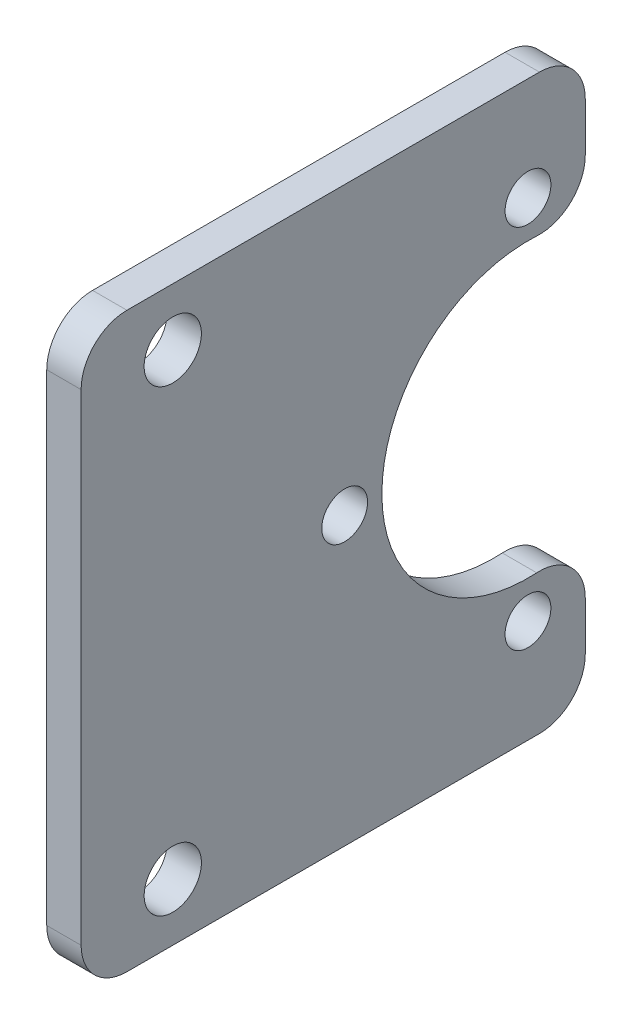
ISO-10303-21;
HEADER;
FILE_DESCRIPTION(('STEP AP214'),'2;1');
FILE_NAME('part.step','',(''),(''),'','','');
FILE_SCHEMA(('AUTOMOTIVE_DESIGN { 1 0 10303 214 1 1 1 1 }'));
ENDSEC;
DATA;
#1=APPLICATION_CONTEXT('core data for automotive mechanical design processes');
#2=APPLICATION_PROTOCOL_DEFINITION('international standard','automotive_design',2000,#1);
#3=PRODUCT_CONTEXT('',#1,'mechanical');
#4=PRODUCT('Part','Part','',(#3));
#5=PRODUCT_RELATED_PRODUCT_CATEGORY('part','',(#4));
#6=PRODUCT_DEFINITION_FORMATION('','',#4);
#7=PRODUCT_DEFINITION_CONTEXT('part definition',#1,'design');
#8=PRODUCT_DEFINITION('design','',#6,#7);
#9=PRODUCT_DEFINITION_SHAPE('','',#8);
#10=(LENGTH_UNIT() NAMED_UNIT(*) SI_UNIT(.MILLI.,.METRE.));
#11=(NAMED_UNIT(*) PLANE_ANGLE_UNIT() SI_UNIT($,.RADIAN.));
#12=(NAMED_UNIT(*) SI_UNIT($,.STERADIAN.) SOLID_ANGLE_UNIT());
#13=UNCERTAINTY_MEASURE_WITH_UNIT(LENGTH_MEASURE(1.E-05),#10,'distance_accuracy_value','');
#14=(GEOMETRIC_REPRESENTATION_CONTEXT(3) GLOBAL_UNCERTAINTY_ASSIGNED_CONTEXT((#13)) GLOBAL_UNIT_ASSIGNED_CONTEXT((#10,
#11,#12)) REPRESENTATION_CONTEXT('',''));
#15=CARTESIAN_POINT('',(0.,0.,0.));
#16=DIRECTION('',(0.,0.,1.));
#17=DIRECTION('',(1.,0.,0.));
#18=AXIS2_PLACEMENT_3D('',#15,#16,#17);
#19=CARTESIAN_POINT('',(3.,0.,-39.));
#20=DIRECTION('',(1.,0.,0.));
#21=DIRECTION('',(0.,0.,-1.));
#22=AXIS2_PLACEMENT_3D('',#19,#20,#21);
#23=PLANE('',#22);
#24=CARTESIAN_POINT('',(3.,20.,-8.));
#25=DIRECTION('',(1.,0.,0.));
#26=DIRECTION('',(0.,0.,-1.));
#27=AXIS2_PLACEMENT_3D('',#24,#25,#26);
#28=CIRCLE('',#27,2.5);
#29=CARTESIAN_POINT('',(3.,20.,-10.5));
#30=VERTEX_POINT('',#29);
#31=EDGE_CURVE('E252',#30,#30,#28,.T.);
#32=ORIENTED_EDGE('',*,*,#31,.F.);
#33=EDGE_LOOP('',(#32));
#34=FACE_BOUND('',#33,.T.);
#35=CARTESIAN_POINT('',(3.,16.,-39.));
#36=DIRECTION('',(1.,0.,0.));
#37=DIRECTION('',(0.,0.,-1.));
#38=AXIS2_PLACEMENT_3D('',#35,#36,#37);
#39=CIRCLE('',#38,2.);
#40=CARTESIAN_POINT('',(3.,16.,-41.));
#41=VERTEX_POINT('',#40);
#42=EDGE_CURVE('E241',#41,#41,#39,.T.);
#43=ORIENTED_EDGE('',*,*,#42,.F.);
#44=EDGE_LOOP('',(#43));
#45=FACE_BOUND('',#44,.T.);
#46=DIRECTION('',(0.,1.,0.));
#47=VECTOR('',#46,1.);
#48=CARTESIAN_POINT('',(3.,25.,-44.));
#49=LINE('',#48,#47);
#50=CARTESIAN_POINT('',(3.,16.720122607206,-44.));
#51=VERTEX_POINT('',#50);
#52=CARTESIAN_POINT('',(3.,21.,-44.));
#53=VERTEX_POINT('',#52);
#54=EDGE_CURVE('E230',#51,#53,#49,.T.);
#55=ORIENTED_EDGE('',*,*,#54,.T.);
#56=CARTESIAN_POINT('',(3.,21.,-40.));
#57=DIRECTION('',(1.,0.,0.));
#58=DIRECTION('',(0.,0.,-1.));
#59=AXIS2_PLACEMENT_3D('',#56,#57,#58);
#60=CIRCLE('',#59,4.);
#61=CARTESIAN_POINT('',(3.,25.,-40.));
#62=VERTEX_POINT('',#61);
#63=EDGE_CURVE('E181',#53,#62,#60,.T.);
#64=ORIENTED_EDGE('',*,*,#63,.T.);
#65=DIRECTION('',(0.,0.,1.));
#66=VECTOR('',#65,1.);
#67=CARTESIAN_POINT('',(3.,25.,0.));
#68=LINE('',#67,#66);
#69=CARTESIAN_POINT('',(3.,25.,-4.00000000000001));
#70=VERTEX_POINT('',#69);
#71=EDGE_CURVE('E143',#62,#70,#68,.T.);
#72=ORIENTED_EDGE('',*,*,#71,.T.);
#73=CARTESIAN_POINT('',(3.,21.,-4.00000000000001));
#74=DIRECTION('',(1.,0.,0.));
#75=DIRECTION('',(0.,0.,-1.));
#76=AXIS2_PLACEMENT_3D('',#73,#74,#75);
#77=CIRCLE('',#76,4.);
#78=CARTESIAN_POINT('',(3.,21.,0.));
#79=VERTEX_POINT('',#78);
#80=EDGE_CURVE('E172',#70,#79,#77,.T.);
#81=ORIENTED_EDGE('',*,*,#80,.T.);
#82=DIRECTION('',(0.,-1.,0.));
#83=VECTOR('',#82,1.);
#84=CARTESIAN_POINT('',(3.,25.,0.));
#85=LINE('',#84,#83);
#86=CARTESIAN_POINT('',(3.,-21.,0.));
#87=VERTEX_POINT('',#86);
#88=EDGE_CURVE('E150',#79,#87,#85,.T.);
#89=ORIENTED_EDGE('',*,*,#88,.T.);
#90=CARTESIAN_POINT('',(3.,-21.,-4.00000000000001));
#91=DIRECTION('',(1.,0.,0.));
#92=DIRECTION('',(0.,0.,-1.));
#93=AXIS2_PLACEMENT_3D('',#90,#91,#92);
#94=CIRCLE('',#93,4.);
#95=CARTESIAN_POINT('',(3.,-25.,-4.00000000000001));
#96=VERTEX_POINT('',#95);
#97=EDGE_CURVE('E174',#87,#96,#94,.T.);
#98=ORIENTED_EDGE('',*,*,#97,.T.);
#99=DIRECTION('',(0.,0.,-1.));
#100=VECTOR('',#99,1.);
#101=CARTESIAN_POINT('',(3.,-25.,0.));
#102=LINE('',#101,#100);
#103=CARTESIAN_POINT('',(3.,-25.,-40.));
#104=VERTEX_POINT('',#103);
#105=EDGE_CURVE('E154',#96,#104,#102,.T.);
#106=ORIENTED_EDGE('',*,*,#105,.T.);
#107=CARTESIAN_POINT('',(3.,-21.,-40.));
#108=DIRECTION('',(1.,0.,0.));
#109=DIRECTION('',(0.,0.,-1.));
#110=AXIS2_PLACEMENT_3D('',#107,#108,#109);
#111=CIRCLE('',#110,4.);
#112=CARTESIAN_POINT('',(3.,-21.,-44.));
#113=VERTEX_POINT('',#112);
#114=EDGE_CURVE('E176',#104,#113,#111,.T.);
#115=ORIENTED_EDGE('',*,*,#114,.T.);
#116=DIRECTION('',(0.,1.,0.));
#117=VECTOR('',#116,1.);
#118=CARTESIAN_POINT('',(3.,-11.7287041057399,-44.));
#119=LINE('',#118,#117);
#120=CARTESIAN_POINT('',(3.,-16.720122607206,-44.));
#121=VERTEX_POINT('',#120);
#122=EDGE_CURVE('E234',#113,#121,#119,.T.);
#123=ORIENTED_EDGE('',*,*,#122,.T.);
#124=CARTESIAN_POINT('',(3.,-16.720122607206,-40.));
#125=DIRECTION('',(1.,0.,0.));
#126=DIRECTION('',(0.,0.,-1.));
#127=AXIS2_PLACEMENT_3D('',#124,#125,#126);
#128=CIRCLE('',#127,4.);
#129=CARTESIAN_POINT('',(3.,-12.7272575069777,-39.7611940298508));
#130=VERTEX_POINT('',#129);
#131=EDGE_CURVE('E55',#121,#130,#128,.T.);
#132=ORIENTED_EDGE('',*,*,#131,.T.);
#133=CARTESIAN_POINT('',(3.,0.,-39.));
#134=DIRECTION('',(-1.,0.,0.));
#135=DIRECTION('',(0.,0.,-1.));
#136=AXIS2_PLACEMENT_3D('',#133,#134,#135);
#137=CIRCLE('',#136,12.75);
#138=CARTESIAN_POINT('',(3.,12.7272575069777,-39.7611940298508));
#139=VERTEX_POINT('',#138);
#140=EDGE_CURVE('E231',#130,#139,#137,.T.);
#141=ORIENTED_EDGE('',*,*,#140,.T.);
#142=CARTESIAN_POINT('',(3.,16.720122607206,-40.));
#143=DIRECTION('',(1.,0.,0.));
#144=DIRECTION('',(0.,0.,-1.));
#145=AXIS2_PLACEMENT_3D('',#142,#143,#144);
#146=CIRCLE('',#145,4.);
#147=EDGE_CURVE('E179',#139,#51,#146,.T.);
#148=ORIENTED_EDGE('',*,*,#147,.T.);
#149=EDGE_LOOP('',(#55,#64,#72,#81,#89,#98,#106,#115,#123,#132,#141,#148));
#150=FACE_BOUND('',#149,.T.);
#151=CARTESIAN_POINT('',(3.,-16.,-39.));
#152=DIRECTION('',(1.,0.,0.));
#153=DIRECTION('',(0.,0.,1.));
#154=AXIS2_PLACEMENT_3D('',#151,#152,#153);
#155=CIRCLE('',#154,2.);
#156=CARTESIAN_POINT('',(3.,-16.,-37.));
#157=VERTEX_POINT('',#156);
#158=EDGE_CURVE('E208',#157,#157,#155,.T.);
#159=ORIENTED_EDGE('',*,*,#158,.F.);
#160=EDGE_LOOP('',(#159));
#161=FACE_BOUND('',#160,.T.);
#162=CARTESIAN_POINT('',(3.,0.,-23.));
#163=DIRECTION('',(1.,0.,0.));
#164=DIRECTION('',(0.,0.,-1.));
#165=AXIS2_PLACEMENT_3D('',#162,#163,#164);
#166=CIRCLE('',#165,2.);
#167=CARTESIAN_POINT('',(3.,0.,-25.));
#168=VERTEX_POINT('',#167);
#169=EDGE_CURVE('E246',#168,#168,#166,.T.);
#170=ORIENTED_EDGE('',*,*,#169,.F.);
#171=EDGE_LOOP('',(#170));
#172=FACE_BOUND('',#171,.T.);
#173=CARTESIAN_POINT('',(3.,-20.,-8.));
#174=DIRECTION('',(1.,0.,0.));
#175=DIRECTION('',(0.,0.,1.));
#176=AXIS2_PLACEMENT_3D('',#173,#174,#175);
#177=CIRCLE('',#176,2.5);
#178=CARTESIAN_POINT('',(3.,-20.,-5.5));
#179=VERTEX_POINT('',#178);
#180=EDGE_CURVE('E258',#179,#179,#177,.T.);
#181=ORIENTED_EDGE('',*,*,#180,.F.);
#182=EDGE_LOOP('',(#181));
#183=FACE_BOUND('',#182,.T.);
#184=ADVANCED_FACE('F33',(#34,#45,#150,#161,#172,#183),#23,.T.);
#185=CARTESIAN_POINT('',(0.,0.,-39.));
#186=DIRECTION('',(1.,0.,0.));
#187=DIRECTION('',(0.,0.,-1.));
#188=AXIS2_PLACEMENT_3D('',#185,#186,#187);
#189=PLANE('',#188);
#190=CARTESIAN_POINT('',(0.,20.,-8.));
#191=DIRECTION('',(1.,0.,0.));
#192=DIRECTION('',(0.,0.,-1.));
#193=AXIS2_PLACEMENT_3D('',#190,#191,#192);
#194=CIRCLE('',#193,2.5);
#195=CARTESIAN_POINT('',(0.,20.,-10.5));
#196=VERTEX_POINT('',#195);
#197=EDGE_CURVE('E255',#196,#196,#194,.T.);
#198=ORIENTED_EDGE('',*,*,#197,.T.);
#199=EDGE_LOOP('',(#198));
#200=FACE_BOUND('',#199,.T.);
#201=CARTESIAN_POINT('',(0.,16.,-39.));
#202=DIRECTION('',(1.,0.,0.));
#203=DIRECTION('',(0.,0.,-1.));
#204=AXIS2_PLACEMENT_3D('',#201,#202,#203);
#205=CIRCLE('',#204,2.);
#206=CARTESIAN_POINT('',(0.,16.,-41.));
#207=VERTEX_POINT('',#206);
#208=EDGE_CURVE('E243',#207,#207,#205,.T.);
#209=ORIENTED_EDGE('',*,*,#208,.T.);
#210=EDGE_LOOP('',(#209));
#211=FACE_BOUND('',#210,.T.);
#212=DIRECTION('',(0.,0.,1.));
#213=VECTOR('',#212,1.);
#214=CARTESIAN_POINT('',(0.,25.,0.));
#215=LINE('',#214,#213);
#216=CARTESIAN_POINT('',(0.,25.,-40.));
#217=VERTEX_POINT('',#216);
#218=CARTESIAN_POINT('',(0.,25.,-4.00000000000001));
#219=VERTEX_POINT('',#218);
#220=EDGE_CURVE('E140',#217,#219,#215,.T.);
#221=ORIENTED_EDGE('',*,*,#220,.F.);
#222=CARTESIAN_POINT('',(0.,21.,-40.));
#223=DIRECTION('',(1.,0.,0.));
#224=DIRECTION('',(0.,0.,-1.));
#225=AXIS2_PLACEMENT_3D('',#222,#223,#224);
#226=CIRCLE('',#225,4.);
#227=CARTESIAN_POINT('',(0.,21.,-44.));
#228=VERTEX_POINT('',#227);
#229=EDGE_CURVE('E123',#217,#228,#226,.F.);
#230=ORIENTED_EDGE('',*,*,#229,.T.);
#231=DIRECTION('',(0.,1.,0.));
#232=VECTOR('',#231,1.);
#233=CARTESIAN_POINT('',(0.,25.,-44.));
#234=LINE('',#233,#232);
#235=CARTESIAN_POINT('',(0.,16.720122607206,-44.));
#236=VERTEX_POINT('',#235);
#237=EDGE_CURVE('E151',#236,#228,#234,.T.);
#238=ORIENTED_EDGE('',*,*,#237,.F.);
#239=CARTESIAN_POINT('',(0.,16.720122607206,-40.));
#240=DIRECTION('',(1.,0.,0.));
#241=DIRECTION('',(0.,0.,-1.));
#242=AXIS2_PLACEMENT_3D('',#239,#240,#241);
#243=CIRCLE('',#242,4.);
#244=CARTESIAN_POINT('',(0.,12.7272575069777,-39.7611940298508));
#245=VERTEX_POINT('',#244);
#246=EDGE_CURVE('E134',#236,#245,#243,.F.);
#247=ORIENTED_EDGE('',*,*,#246,.T.);
#248=CARTESIAN_POINT('',(0.,0.,-39.));
#249=DIRECTION('',(-1.,0.,0.));
#250=DIRECTION('',(0.,0.,-1.));
#251=AXIS2_PLACEMENT_3D('',#248,#249,#250);
#252=CIRCLE('',#251,12.75);
#253=CARTESIAN_POINT('',(0.,-12.7272575069777,-39.7611940298508));
#254=VERTEX_POINT('',#253);
#255=EDGE_CURVE('E156',#254,#245,#252,.T.);
#256=ORIENTED_EDGE('',*,*,#255,.F.);
#257=CARTESIAN_POINT('',(0.,-16.720122607206,-40.));
#258=DIRECTION('',(1.,0.,0.));
#259=DIRECTION('',(0.,0.,-1.));
#260=AXIS2_PLACEMENT_3D('',#257,#258,#259);
#261=CIRCLE('',#260,4.);
#262=CARTESIAN_POINT('',(0.,-16.720122607206,-44.));
#263=VERTEX_POINT('',#262);
#264=EDGE_CURVE('E166',#254,#263,#261,.F.);
#265=ORIENTED_EDGE('',*,*,#264,.T.);
#266=DIRECTION('',(0.,1.,0.));
#267=VECTOR('',#266,1.);
#268=CARTESIAN_POINT('',(0.,-11.7287041057399,-44.));
#269=LINE('',#268,#267);
#270=CARTESIAN_POINT('',(0.,-21.,-44.));
#271=VERTEX_POINT('',#270);
#272=EDGE_CURVE('E211',#271,#263,#269,.T.);
#273=ORIENTED_EDGE('',*,*,#272,.F.);
#274=CARTESIAN_POINT('',(0.,-21.,-40.));
#275=DIRECTION('',(1.,0.,0.));
#276=DIRECTION('',(0.,0.,-1.));
#277=AXIS2_PLACEMENT_3D('',#274,#275,#276);
#278=CIRCLE('',#277,4.);
#279=CARTESIAN_POINT('',(0.,-25.,-40.));
#280=VERTEX_POINT('',#279);
#281=EDGE_CURVE('E164',#271,#280,#278,.F.);
#282=ORIENTED_EDGE('',*,*,#281,.T.);
#283=DIRECTION('',(0.,0.,-1.));
#284=VECTOR('',#283,1.);
#285=CARTESIAN_POINT('',(0.,-25.,0.));
#286=LINE('',#285,#284);
#287=CARTESIAN_POINT('',(0.,-25.,-4.00000000000001));
#288=VERTEX_POINT('',#287);
#289=EDGE_CURVE('E207',#288,#280,#286,.T.);
#290=ORIENTED_EDGE('',*,*,#289,.F.);
#291=CARTESIAN_POINT('',(0.,-21.,-4.00000000000001));
#292=DIRECTION('',(1.,0.,0.));
#293=DIRECTION('',(0.,0.,-1.));
#294=AXIS2_PLACEMENT_3D('',#291,#292,#293);
#295=CIRCLE('',#294,4.);
#296=CARTESIAN_POINT('',(0.,-21.,0.));
#297=VERTEX_POINT('',#296);
#298=EDGE_CURVE('E162',#288,#297,#295,.F.);
#299=ORIENTED_EDGE('',*,*,#298,.T.);
#300=DIRECTION('',(0.,-1.,0.));
#301=VECTOR('',#300,1.);
#302=CARTESIAN_POINT('',(0.,25.,0.));
#303=LINE('',#302,#301);
#304=CARTESIAN_POINT('',(0.,21.,0.));
#305=VERTEX_POINT('',#304);
#306=EDGE_CURVE('E202',#305,#297,#303,.T.);
#307=ORIENTED_EDGE('',*,*,#306,.F.);
#308=CARTESIAN_POINT('',(0.,21.,-4.00000000000001));
#309=DIRECTION('',(1.,0.,0.));
#310=DIRECTION('',(0.,0.,-1.));
#311=AXIS2_PLACEMENT_3D('',#308,#309,#310);
#312=CIRCLE('',#311,4.);
#313=EDGE_CURVE('E144',#305,#219,#312,.F.);
#314=ORIENTED_EDGE('',*,*,#313,.T.);
#315=EDGE_LOOP('',(#221,#230,#238,#247,#256,#265,#273,#282,#290,#299,#307,#314));
#316=FACE_BOUND('',#315,.T.);
#317=CARTESIAN_POINT('',(0.,-16.,-39.));
#318=DIRECTION('',(1.,0.,0.));
#319=DIRECTION('',(0.,0.,1.));
#320=AXIS2_PLACEMENT_3D('',#317,#318,#319);
#321=CIRCLE('',#320,2.);
#322=CARTESIAN_POINT('',(0.,-16.,-37.));
#323=VERTEX_POINT('',#322);
#324=EDGE_CURVE('E214',#323,#323,#321,.T.);
#325=ORIENTED_EDGE('',*,*,#324,.T.);
#326=EDGE_LOOP('',(#325));
#327=FACE_BOUND('',#326,.T.);
#328=CARTESIAN_POINT('',(0.,0.,-23.));
#329=DIRECTION('',(1.,0.,0.));
#330=DIRECTION('',(0.,0.,-1.));
#331=AXIS2_PLACEMENT_3D('',#328,#329,#330);
#332=CIRCLE('',#331,2.);
#333=CARTESIAN_POINT('',(0.,0.,-25.));
#334=VERTEX_POINT('',#333);
#335=EDGE_CURVE('E249',#334,#334,#332,.T.);
#336=ORIENTED_EDGE('',*,*,#335,.T.);
#337=EDGE_LOOP('',(#336));
#338=FACE_BOUND('',#337,.T.);
#339=CARTESIAN_POINT('',(0.,-20.,-8.));
#340=DIRECTION('',(1.,0.,0.));
#341=DIRECTION('',(0.,0.,1.));
#342=AXIS2_PLACEMENT_3D('',#339,#340,#341);
#343=CIRCLE('',#342,2.5);
#344=CARTESIAN_POINT('',(0.,-20.,-5.5));
#345=VERTEX_POINT('',#344);
#346=EDGE_CURVE('E261',#345,#345,#343,.T.);
#347=ORIENTED_EDGE('',*,*,#346,.T.);
#348=EDGE_LOOP('',(#347));
#349=FACE_BOUND('',#348,.T.);
#350=ADVANCED_FACE('F147',(#200,#211,#316,#327,#338,#349),#189,.F.);
#351=CARTESIAN_POINT('',(3.,25.,0.));
#352=DIRECTION('',(0.,0.,-1.));
#353=DIRECTION('',(-1.,0.,0.));
#354=AXIS2_PLACEMENT_3D('',#351,#352,#353);
#355=PLANE('',#354);
#356=ORIENTED_EDGE('',*,*,#306,.T.);
#357=DIRECTION('',(-1.,0.,0.));
#358=VECTOR('',#357,1.);
#359=CARTESIAN_POINT('',(3.,-21.,0.));
#360=LINE('',#359,#358);
#361=EDGE_CURVE('E11',#297,#87,#360,.F.);
#362=ORIENTED_EDGE('',*,*,#361,.T.);
#363=ORIENTED_EDGE('',*,*,#88,.F.);
#364=DIRECTION('',(-1.,0.,0.));
#365=VECTOR('',#364,1.);
#366=CARTESIAN_POINT('',(3.,21.,0.));
#367=LINE('',#366,#365);
#368=EDGE_CURVE('E41',#79,#305,#367,.T.);
#369=ORIENTED_EDGE('',*,*,#368,.T.);
#370=EDGE_LOOP('',(#356,#362,#363,#369));
#371=FACE_BOUND('',#370,.T.);
#372=ADVANCED_FACE('F201',(#371),#355,.F.);
#373=CARTESIAN_POINT('',(3.,-25.,0.));
#374=DIRECTION('',(0.,1.,0.));
#375=DIRECTION('',(0.,0.,1.));
#376=AXIS2_PLACEMENT_3D('',#373,#374,#375);
#377=PLANE('',#376);
#378=ORIENTED_EDGE('',*,*,#289,.T.);
#379=DIRECTION('',(-1.,0.,0.));
#380=VECTOR('',#379,1.);
#381=CARTESIAN_POINT('',(3.,-25.,-40.));
#382=LINE('',#381,#380);
#383=EDGE_CURVE('E195',#280,#104,#382,.F.);
#384=ORIENTED_EDGE('',*,*,#383,.T.);
#385=ORIENTED_EDGE('',*,*,#105,.F.);
#386=DIRECTION('',(-1.,0.,0.));
#387=VECTOR('',#386,1.);
#388=CARTESIAN_POINT('',(3.,-25.,-4.00000000000001));
#389=LINE('',#388,#387);
#390=EDGE_CURVE('E192',#96,#288,#389,.T.);
#391=ORIENTED_EDGE('',*,*,#390,.T.);
#392=EDGE_LOOP('',(#378,#384,#385,#391));
#393=FACE_BOUND('',#392,.T.);
#394=ADVANCED_FACE('F293',(#393),#377,.F.);
#395=CARTESIAN_POINT('',(3.,-11.7287041057399,-44.));
#396=DIRECTION('',(0.,0.,1.));
#397=DIRECTION('',(0.,-1.,0.));
#398=AXIS2_PLACEMENT_3D('',#395,#396,#397);
#399=PLANE('',#398);
#400=ORIENTED_EDGE('',*,*,#272,.T.);
#401=DIRECTION('',(-1.,0.,0.));
#402=VECTOR('',#401,1.);
#403=CARTESIAN_POINT('',(3.,-16.720122607206,-44.));
#404=LINE('',#403,#402);
#405=EDGE_CURVE('E190',#263,#121,#404,.F.);
#406=ORIENTED_EDGE('',*,*,#405,.T.);
#407=ORIENTED_EDGE('',*,*,#122,.F.);
#408=DIRECTION('',(-1.,0.,0.));
#409=VECTOR('',#408,1.);
#410=CARTESIAN_POINT('',(3.,-21.,-44.));
#411=LINE('',#410,#409);
#412=EDGE_CURVE('E187',#113,#271,#411,.T.);
#413=ORIENTED_EDGE('',*,*,#412,.T.);
#414=EDGE_LOOP('',(#400,#406,#407,#413));
#415=FACE_BOUND('',#414,.T.);
#416=ADVANCED_FACE('F290',(#415),#399,.F.);
#417=CARTESIAN_POINT('',(3.,0.,-39.));
#418=DIRECTION('',(-1.,0.,0.));
#419=DIRECTION('',(0.,0.,1.));
#420=AXIS2_PLACEMENT_3D('',#417,#418,#419);
#421=CYLINDRICAL_SURFACE('',#420,12.75);
#422=ORIENTED_EDGE('',*,*,#255,.T.);
#423=DIRECTION('',(-1.,0.,0.));
#424=VECTOR('',#423,1.);
#425=CARTESIAN_POINT('',(3.,12.7272575069777,-39.7611940298508));
#426=LINE('',#425,#424);
#427=EDGE_CURVE('E48',#245,#139,#426,.F.);
#428=ORIENTED_EDGE('',*,*,#427,.T.);
#429=ORIENTED_EDGE('',*,*,#140,.F.);
#430=DIRECTION('',(-1.,0.,0.));
#431=VECTOR('',#430,1.);
#432=CARTESIAN_POINT('',(3.,-12.7272575069777,-39.7611940298508));
#433=LINE('',#432,#431);
#434=EDGE_CURVE('E183',#130,#254,#433,.T.);
#435=ORIENTED_EDGE('',*,*,#434,.T.);
#436=EDGE_LOOP('',(#422,#428,#429,#435));
#437=FACE_BOUND('',#436,.T.);
#438=ADVANCED_FACE('F221',(#437),#421,.F.);
#439=CARTESIAN_POINT('',(3.,25.,-44.));
#440=DIRECTION('',(0.,0.,1.));
#441=DIRECTION('',(0.,-1.,0.));
#442=AXIS2_PLACEMENT_3D('',#439,#440,#441);
#443=PLANE('',#442);
#444=ORIENTED_EDGE('',*,*,#237,.T.);
#445=DIRECTION('',(-1.,0.,0.));
#446=VECTOR('',#445,1.);
#447=CARTESIAN_POINT('',(3.,21.,-44.));
#448=LINE('',#447,#446);
#449=EDGE_CURVE('E128',#228,#53,#448,.F.);
#450=ORIENTED_EDGE('',*,*,#449,.T.);
#451=ORIENTED_EDGE('',*,*,#54,.F.);
#452=DIRECTION('',(-1.,0.,0.));
#453=VECTOR('',#452,1.);
#454=CARTESIAN_POINT('',(3.,16.720122607206,-44.));
#455=LINE('',#454,#453);
#456=EDGE_CURVE('E133',#51,#236,#455,.T.);
#457=ORIENTED_EDGE('',*,*,#456,.T.);
#458=EDGE_LOOP('',(#444,#450,#451,#457));
#459=FACE_BOUND('',#458,.T.);
#460=ADVANCED_FACE('F233',(#459),#443,.F.);
#461=CARTESIAN_POINT('',(3.,25.,0.));
#462=DIRECTION('',(0.,-1.,0.));
#463=DIRECTION('',(0.,0.,-1.));
#464=AXIS2_PLACEMENT_3D('',#461,#462,#463);
#465=PLANE('',#464);
#466=ORIENTED_EDGE('',*,*,#71,.F.);
#467=DIRECTION('',(-1.,0.,0.));
#468=VECTOR('',#467,1.);
#469=CARTESIAN_POINT('',(3.,25.,-40.));
#470=LINE('',#469,#468);
#471=EDGE_CURVE('E127',#62,#217,#470,.T.);
#472=ORIENTED_EDGE('',*,*,#471,.T.);
#473=ORIENTED_EDGE('',*,*,#220,.T.);
#474=DIRECTION('',(-1.,0.,0.));
#475=VECTOR('',#474,1.);
#476=CARTESIAN_POINT('',(3.,25.,-4.00000000000001));
#477=LINE('',#476,#475);
#478=EDGE_CURVE('E145',#219,#70,#477,.F.);
#479=ORIENTED_EDGE('',*,*,#478,.T.);
#480=EDGE_LOOP('',(#466,#472,#473,#479));
#481=FACE_BOUND('',#480,.T.);
#482=ADVANCED_FACE('F139',(#481),#465,.F.);
#483=CARTESIAN_POINT('',(3.,-16.,-39.));
#484=DIRECTION('',(-1.,0.,0.));
#485=DIRECTION('',(0.,0.,1.));
#486=AXIS2_PLACEMENT_3D('',#483,#484,#485);
#487=CYLINDRICAL_SURFACE('',#486,2.);
#488=ORIENTED_EDGE('',*,*,#158,.T.);
#489=EDGE_LOOP('',(#488));
#490=FACE_BOUND('',#489,.T.);
#491=ORIENTED_EDGE('',*,*,#324,.F.);
#492=EDGE_LOOP('',(#491));
#493=FACE_BOUND('',#492,.T.);
#494=ADVANCED_FACE('F281',(#490,#493),#487,.F.);
#495=CARTESIAN_POINT('',(3.,16.,-39.));
#496=DIRECTION('',(-1.,0.,0.));
#497=DIRECTION('',(0.,0.,1.));
#498=AXIS2_PLACEMENT_3D('',#495,#496,#497);
#499=CYLINDRICAL_SURFACE('',#498,2.);
#500=ORIENTED_EDGE('',*,*,#42,.T.);
#501=EDGE_LOOP('',(#500));
#502=FACE_BOUND('',#501,.T.);
#503=ORIENTED_EDGE('',*,*,#208,.F.);
#504=EDGE_LOOP('',(#503));
#505=FACE_BOUND('',#504,.T.);
#506=ADVANCED_FACE('F432',(#502,#505),#499,.F.);
#507=CARTESIAN_POINT('',(3.,0.,-23.));
#508=DIRECTION('',(-1.,0.,0.));
#509=DIRECTION('',(0.,0.,1.));
#510=AXIS2_PLACEMENT_3D('',#507,#508,#509);
#511=CYLINDRICAL_SURFACE('',#510,2.);
#512=ORIENTED_EDGE('',*,*,#169,.T.);
#513=EDGE_LOOP('',(#512));
#514=FACE_BOUND('',#513,.T.);
#515=ORIENTED_EDGE('',*,*,#335,.F.);
#516=EDGE_LOOP('',(#515));
#517=FACE_BOUND('',#516,.T.);
#518=ADVANCED_FACE('F422',(#514,#517),#511,.F.);
#519=CARTESIAN_POINT('',(3.,20.,-8.));
#520=DIRECTION('',(-1.,0.,0.));
#521=DIRECTION('',(0.,0.,1.));
#522=AXIS2_PLACEMENT_3D('',#519,#520,#521);
#523=CYLINDRICAL_SURFACE('',#522,2.5);
#524=ORIENTED_EDGE('',*,*,#31,.T.);
#525=EDGE_LOOP('',(#524));
#526=FACE_BOUND('',#525,.T.);
#527=ORIENTED_EDGE('',*,*,#197,.F.);
#528=EDGE_LOOP('',(#527));
#529=FACE_BOUND('',#528,.T.);
#530=ADVANCED_FACE('F413',(#526,#529),#523,.F.);
#531=CARTESIAN_POINT('',(3.,-20.,-8.));
#532=DIRECTION('',(-1.,0.,0.));
#533=DIRECTION('',(0.,0.,1.));
#534=AXIS2_PLACEMENT_3D('',#531,#532,#533);
#535=CYLINDRICAL_SURFACE('',#534,2.5);
#536=ORIENTED_EDGE('',*,*,#180,.T.);
#537=EDGE_LOOP('',(#536));
#538=FACE_BOUND('',#537,.T.);
#539=ORIENTED_EDGE('',*,*,#346,.F.);
#540=EDGE_LOOP('',(#539));
#541=FACE_BOUND('',#540,.T.);
#542=ADVANCED_FACE('F267',(#538,#541),#535,.F.);
#543=CARTESIAN_POINT('',(3.,21.,-40.));
#544=DIRECTION('',(-1.,0.,0.));
#545=DIRECTION('',(0.,0.,1.));
#546=AXIS2_PLACEMENT_3D('',#543,#544,#545);
#547=CYLINDRICAL_SURFACE('',#546,4.);
#548=ORIENTED_EDGE('',*,*,#63,.F.);
#549=ORIENTED_EDGE('',*,*,#449,.F.);
#550=ORIENTED_EDGE('',*,*,#229,.F.);
#551=ORIENTED_EDGE('',*,*,#471,.F.);
#552=EDGE_LOOP('',(#548,#549,#550,#551));
#553=FACE_BOUND('',#552,.T.);
#554=ADVANCED_FACE('F126',(#553),#547,.T.);
#555=CARTESIAN_POINT('',(3.,16.720122607206,-40.));
#556=DIRECTION('',(-1.,0.,0.));
#557=DIRECTION('',(0.,0.,1.));
#558=AXIS2_PLACEMENT_3D('',#555,#556,#557);
#559=CYLINDRICAL_SURFACE('',#558,4.);
#560=ORIENTED_EDGE('',*,*,#147,.F.);
#561=ORIENTED_EDGE('',*,*,#427,.F.);
#562=ORIENTED_EDGE('',*,*,#246,.F.);
#563=ORIENTED_EDGE('',*,*,#456,.F.);
#564=EDGE_LOOP('',(#560,#561,#562,#563));
#565=FACE_BOUND('',#564,.T.);
#566=ADVANCED_FACE('F225',(#565),#559,.T.);
#567=CARTESIAN_POINT('',(3.,-16.720122607206,-40.));
#568=DIRECTION('',(-1.,0.,0.));
#569=DIRECTION('',(0.,0.,1.));
#570=AXIS2_PLACEMENT_3D('',#567,#568,#569);
#571=CYLINDRICAL_SURFACE('',#570,4.);
#572=ORIENTED_EDGE('',*,*,#131,.F.);
#573=ORIENTED_EDGE('',*,*,#405,.F.);
#574=ORIENTED_EDGE('',*,*,#264,.F.);
#575=ORIENTED_EDGE('',*,*,#434,.F.);
#576=EDGE_LOOP('',(#572,#573,#574,#575));
#577=FACE_BOUND('',#576,.T.);
#578=ADVANCED_FACE('F304',(#577),#571,.T.);
#579=CARTESIAN_POINT('',(3.,-21.,-40.));
#580=DIRECTION('',(-1.,0.,0.));
#581=DIRECTION('',(0.,0.,1.));
#582=AXIS2_PLACEMENT_3D('',#579,#580,#581);
#583=CYLINDRICAL_SURFACE('',#582,4.);
#584=ORIENTED_EDGE('',*,*,#114,.F.);
#585=ORIENTED_EDGE('',*,*,#383,.F.);
#586=ORIENTED_EDGE('',*,*,#281,.F.);
#587=ORIENTED_EDGE('',*,*,#412,.F.);
#588=EDGE_LOOP('',(#584,#585,#586,#587));
#589=FACE_BOUND('',#588,.T.);
#590=ADVANCED_FACE('F307',(#589),#583,.T.);
#591=CARTESIAN_POINT('',(3.,-21.,-4.00000000000001));
#592=DIRECTION('',(-1.,0.,0.));
#593=DIRECTION('',(0.,0.,1.));
#594=AXIS2_PLACEMENT_3D('',#591,#592,#593);
#595=CYLINDRICAL_SURFACE('',#594,4.);
#596=ORIENTED_EDGE('',*,*,#97,.F.);
#597=ORIENTED_EDGE('',*,*,#361,.F.);
#598=ORIENTED_EDGE('',*,*,#298,.F.);
#599=ORIENTED_EDGE('',*,*,#390,.F.);
#600=EDGE_LOOP('',(#596,#597,#598,#599));
#601=FACE_BOUND('',#600,.T.);
#602=ADVANCED_FACE('F310',(#601),#595,.T.);
#603=CARTESIAN_POINT('',(3.,21.,-4.00000000000001));
#604=DIRECTION('',(-1.,0.,0.));
#605=DIRECTION('',(0.,0.,1.));
#606=AXIS2_PLACEMENT_3D('',#603,#604,#605);
#607=CYLINDRICAL_SURFACE('',#606,4.);
#608=ORIENTED_EDGE('',*,*,#80,.F.);
#609=ORIENTED_EDGE('',*,*,#478,.F.);
#610=ORIENTED_EDGE('',*,*,#313,.F.);
#611=ORIENTED_EDGE('',*,*,#368,.F.);
#612=EDGE_LOOP('',(#608,#609,#610,#611));
#613=FACE_BOUND('',#612,.T.);
#614=ADVANCED_FACE('F35',(#613),#607,.T.);
#615=CLOSED_SHELL('',(#184,#350,#372,#394,#416,#438,#460,#482,#494,#506,#518,#530,#542,#554,
#566,#578,#590,#602,#614));
#616=MANIFOLD_SOLID_BREP('B2',#615);
#617=ADVANCED_BREP_SHAPE_REPRESENTATION('',(#18,#616),#14);
#618=SHAPE_DEFINITION_REPRESENTATION(#9,#617);
ENDSEC;
END-ISO-10303-21;
